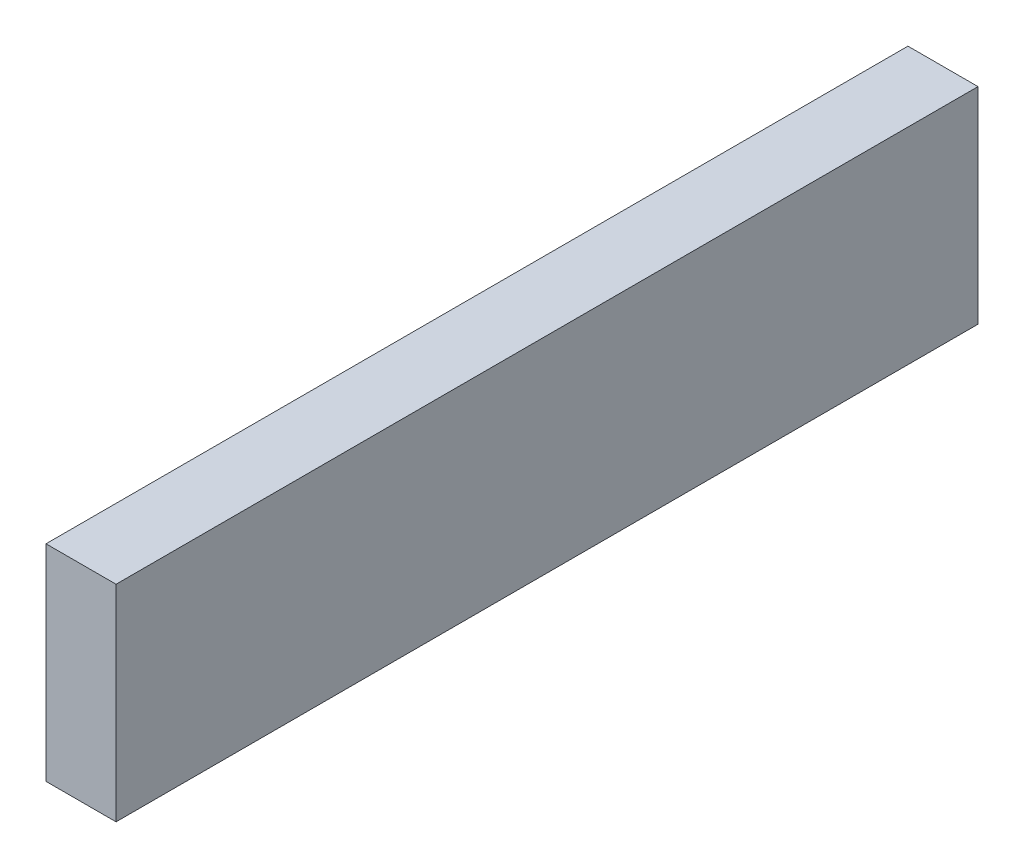
ISO-10303-21;
HEADER;
FILE_DESCRIPTION(('STEP AP214'),'2;1');
FILE_NAME('part.step','',(''),(''),'','','');
FILE_SCHEMA(('AUTOMOTIVE_DESIGN { 1 0 10303 214 1 1 1 1 }'));
ENDSEC;
DATA;
#1=APPLICATION_CONTEXT('core data for automotive mechanical design processes');
#2=APPLICATION_PROTOCOL_DEFINITION('international standard','automotive_design',2000,#1);
#3=PRODUCT_CONTEXT('',#1,'mechanical');
#4=PRODUCT('Part','Part','',(#3));
#5=PRODUCT_RELATED_PRODUCT_CATEGORY('part','',(#4));
#6=PRODUCT_DEFINITION_FORMATION('','',#4);
#7=PRODUCT_DEFINITION_CONTEXT('part definition',#1,'design');
#8=PRODUCT_DEFINITION('design','',#6,#7);
#9=PRODUCT_DEFINITION_SHAPE('','',#8);
#10=(LENGTH_UNIT() NAMED_UNIT(*) SI_UNIT(.MILLI.,.METRE.));
#11=(NAMED_UNIT(*) PLANE_ANGLE_UNIT() SI_UNIT($,.RADIAN.));
#12=(NAMED_UNIT(*) SI_UNIT($,.STERADIAN.) SOLID_ANGLE_UNIT());
#13=UNCERTAINTY_MEASURE_WITH_UNIT(LENGTH_MEASURE(1.E-05),#10,'distance_accuracy_value','');
#14=(GEOMETRIC_REPRESENTATION_CONTEXT(3) GLOBAL_UNCERTAINTY_ASSIGNED_CONTEXT((#13)) GLOBAL_UNIT_ASSIGNED_CONTEXT((#10,
#11,#12)) REPRESENTATION_CONTEXT('',''));
#15=CARTESIAN_POINT('',(0.,0.,0.));
#16=DIRECTION('',(0.,0.,1.));
#17=DIRECTION('',(1.,0.,0.));
#18=AXIS2_PLACEMENT_3D('',#15,#16,#17);
#19=CARTESIAN_POINT('',(-10.16,29.845,250.));
#20=DIRECTION('',(1.,0.,0.));
#21=DIRECTION('',(0.,1.,0.));
#22=AXIS2_PLACEMENT_3D('',#19,#20,#21);
#23=PLANE('',#22);
#24=DIRECTION('',(0.,-1.,0.));
#25=VECTOR('',#24,1.);
#26=CARTESIAN_POINT('',(-10.16,29.845,0.));
#27=LINE('',#26,#25);
#28=CARTESIAN_POINT('',(-10.16,29.845,0.));
#29=VERTEX_POINT('',#28);
#30=CARTESIAN_POINT('',(-10.16,-29.845,0.));
#31=VERTEX_POINT('',#30);
#32=EDGE_CURVE('E96',#29,#31,#27,.T.);
#33=ORIENTED_EDGE('',*,*,#32,.T.);
#34=DIRECTION('',(0.,0.,-1.));
#35=VECTOR('',#34,1.);
#36=CARTESIAN_POINT('',(-10.16,-29.845,250.));
#37=LINE('',#36,#35);
#38=CARTESIAN_POINT('',(-10.16,-29.845,250.));
#39=VERTEX_POINT('',#38);
#40=EDGE_CURVE('E11',#39,#31,#37,.T.);
#41=ORIENTED_EDGE('',*,*,#40,.F.);
#42=DIRECTION('',(0.,-1.,0.));
#43=VECTOR('',#42,1.);
#44=CARTESIAN_POINT('',(-10.16,29.845,250.));
#45=LINE('',#44,#43);
#46=CARTESIAN_POINT('',(-10.16,29.845,250.));
#47=VERTEX_POINT('',#46);
#48=EDGE_CURVE('E84',#47,#39,#45,.T.);
#49=ORIENTED_EDGE('',*,*,#48,.F.);
#50=DIRECTION('',(0.,0.,-1.));
#51=VECTOR('',#50,1.);
#52=CARTESIAN_POINT('',(-10.16,29.845,250.));
#53=LINE('',#52,#51);
#54=EDGE_CURVE('E92',#47,#29,#53,.T.);
#55=ORIENTED_EDGE('',*,*,#54,.T.);
#56=EDGE_LOOP('',(#33,#41,#49,#55));
#57=FACE_BOUND('',#56,.T.);
#58=ADVANCED_FACE('F33',(#57),#23,.F.);
#59=CARTESIAN_POINT('',(10.16,-29.845,250.));
#60=DIRECTION('',(0.,1.,0.));
#61=DIRECTION('',(0.,0.,1.));
#62=AXIS2_PLACEMENT_3D('',#59,#60,#61);
#63=PLANE('',#62);
#64=DIRECTION('',(1.,0.,0.));
#65=VECTOR('',#64,1.);
#66=CARTESIAN_POINT('',(10.16,-29.845,0.));
#67=LINE('',#66,#65);
#68=CARTESIAN_POINT('',(10.16,-29.845,0.));
#69=VERTEX_POINT('',#68);
#70=EDGE_CURVE('E88',#31,#69,#67,.T.);
#71=ORIENTED_EDGE('',*,*,#70,.T.);
#72=DIRECTION('',(0.,0.,-1.));
#73=VECTOR('',#72,1.);
#74=CARTESIAN_POINT('',(10.16,-29.845,250.));
#75=LINE('',#74,#73);
#76=CARTESIAN_POINT('',(10.16,-29.845,250.));
#77=VERTEX_POINT('',#76);
#78=EDGE_CURVE('E41',#77,#69,#75,.T.);
#79=ORIENTED_EDGE('',*,*,#78,.F.);
#80=DIRECTION('',(1.,0.,0.));
#81=VECTOR('',#80,1.);
#82=CARTESIAN_POINT('',(10.16,-29.845,250.));
#83=LINE('',#82,#81);
#84=EDGE_CURVE('E79',#39,#77,#83,.T.);
#85=ORIENTED_EDGE('',*,*,#84,.F.);
#86=ORIENTED_EDGE('',*,*,#40,.T.);
#87=EDGE_LOOP('',(#71,#79,#85,#86));
#88=FACE_BOUND('',#87,.T.);
#89=ADVANCED_FACE('F87',(#88),#63,.F.);
#90=CARTESIAN_POINT('',(10.16,29.845,250.));
#91=DIRECTION('',(-1.,0.,0.));
#92=DIRECTION('',(0.,-1.,0.));
#93=AXIS2_PLACEMENT_3D('',#90,#91,#92);
#94=PLANE('',#93);
#95=DIRECTION('',(0.,1.,0.));
#96=VECTOR('',#95,1.);
#97=CARTESIAN_POINT('',(10.16,29.845,0.));
#98=LINE('',#97,#96);
#99=CARTESIAN_POINT('',(10.16,29.845,0.));
#100=VERTEX_POINT('',#99);
#101=EDGE_CURVE('E66',#69,#100,#98,.T.);
#102=ORIENTED_EDGE('',*,*,#101,.T.);
#103=DIRECTION('',(0.,0.,-1.));
#104=VECTOR('',#103,1.);
#105=CARTESIAN_POINT('',(10.16,29.845,250.));
#106=LINE('',#105,#104);
#107=CARTESIAN_POINT('',(10.16,29.845,250.));
#108=VERTEX_POINT('',#107);
#109=EDGE_CURVE('E89',#108,#100,#106,.T.);
#110=ORIENTED_EDGE('',*,*,#109,.F.);
#111=DIRECTION('',(0.,1.,0.));
#112=VECTOR('',#111,1.);
#113=CARTESIAN_POINT('',(10.16,29.845,250.));
#114=LINE('',#113,#112);
#115=EDGE_CURVE('E82',#77,#108,#114,.T.);
#116=ORIENTED_EDGE('',*,*,#115,.F.);
#117=ORIENTED_EDGE('',*,*,#78,.T.);
#118=EDGE_LOOP('',(#102,#110,#116,#117));
#119=FACE_BOUND('',#118,.T.);
#120=ADVANCED_FACE('F90',(#119),#94,.F.);
#121=CARTESIAN_POINT('',(10.16,29.845,250.));
#122=DIRECTION('',(0.,-1.,0.));
#123=DIRECTION('',(1.,0.,0.));
#124=AXIS2_PLACEMENT_3D('',#121,#122,#123);
#125=PLANE('',#124);
#126=DIRECTION('',(-1.,0.,0.));
#127=VECTOR('',#126,1.);
#128=CARTESIAN_POINT('',(10.16,29.845,0.));
#129=LINE('',#128,#127);
#130=EDGE_CURVE('E72',#100,#29,#129,.T.);
#131=ORIENTED_EDGE('',*,*,#130,.T.);
#132=ORIENTED_EDGE('',*,*,#54,.F.);
#133=DIRECTION('',(-1.,0.,0.));
#134=VECTOR('',#133,1.);
#135=CARTESIAN_POINT('',(10.16,29.845,250.));
#136=LINE('',#135,#134);
#137=EDGE_CURVE('E49',#108,#47,#136,.T.);
#138=ORIENTED_EDGE('',*,*,#137,.F.);
#139=ORIENTED_EDGE('',*,*,#109,.T.);
#140=EDGE_LOOP('',(#131,#132,#138,#139));
#141=FACE_BOUND('',#140,.T.);
#142=ADVANCED_FACE('F103',(#141),#125,.F.);
#143=CARTESIAN_POINT('',(0.,0.,250.));
#144=DIRECTION('',(0.,0.,-1.));
#145=DIRECTION('',(-1.,0.,0.));
#146=AXIS2_PLACEMENT_3D('',#143,#144,#145);
#147=PLANE('',#146);
#148=ORIENTED_EDGE('',*,*,#48,.T.);
#149=ORIENTED_EDGE('',*,*,#84,.T.);
#150=ORIENTED_EDGE('',*,*,#115,.T.);
#151=ORIENTED_EDGE('',*,*,#137,.T.);
#152=EDGE_LOOP('',(#148,#149,#150,#151));
#153=FACE_BOUND('',#152,.T.);
#154=ADVANCED_FACE('F80',(#153),#147,.F.);
#155=CARTESIAN_POINT('',(0.,0.,0.));
#156=DIRECTION('',(0.,0.,-1.));
#157=DIRECTION('',(-1.,0.,0.));
#158=AXIS2_PLACEMENT_3D('',#155,#156,#157);
#159=PLANE('',#158);
#160=ORIENTED_EDGE('',*,*,#32,.F.);
#161=ORIENTED_EDGE('',*,*,#130,.F.);
#162=ORIENTED_EDGE('',*,*,#101,.F.);
#163=ORIENTED_EDGE('',*,*,#70,.F.);
#164=EDGE_LOOP('',(#160,#161,#162,#163));
#165=FACE_BOUND('',#164,.T.);
#166=ADVANCED_FACE('F106',(#165),#159,.T.);
#167=CLOSED_SHELL('',(#58,#89,#120,#142,#154,#166));
#168=MANIFOLD_SOLID_BREP('B2',#167);
#169=ADVANCED_BREP_SHAPE_REPRESENTATION('',(#18,#168),#14);
#170=SHAPE_DEFINITION_REPRESENTATION(#9,#169);
ENDSEC;
END-ISO-10303-21;
